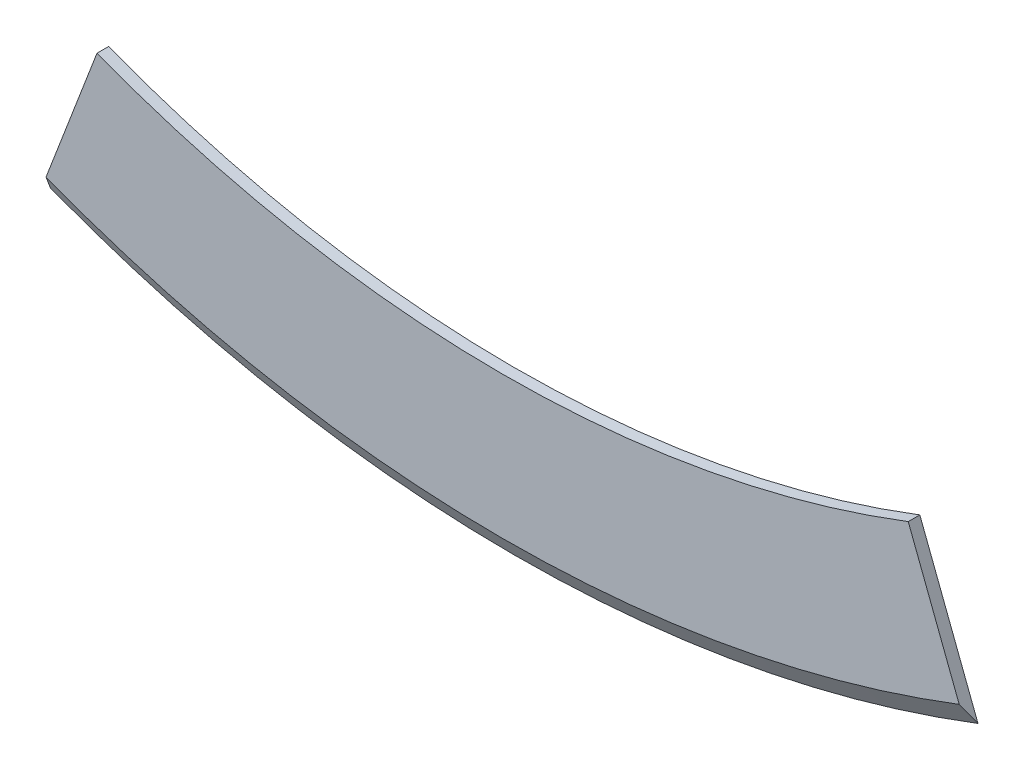
ISO-10303-21;
HEADER;
FILE_DESCRIPTION(('STEP AP214'),'2;1');
FILE_NAME('part.step','',(''),(''),'','','');
FILE_SCHEMA(('AUTOMOTIVE_DESIGN { 1 0 10303 214 1 1 1 1 }'));
ENDSEC;
DATA;
#1=APPLICATION_CONTEXT('core data for automotive mechanical design processes');
#2=APPLICATION_PROTOCOL_DEFINITION('international standard','automotive_design',2000,#1);
#3=PRODUCT_CONTEXT('',#1,'mechanical');
#4=PRODUCT('Part','Part','',(#3));
#5=PRODUCT_RELATED_PRODUCT_CATEGORY('part','',(#4));
#6=PRODUCT_DEFINITION_FORMATION('','',#4);
#7=PRODUCT_DEFINITION_CONTEXT('part definition',#1,'design');
#8=PRODUCT_DEFINITION('design','',#6,#7);
#9=PRODUCT_DEFINITION_SHAPE('','',#8);
#10=(LENGTH_UNIT() NAMED_UNIT(*) SI_UNIT(.MILLI.,.METRE.));
#11=(NAMED_UNIT(*) PLANE_ANGLE_UNIT() SI_UNIT($,.RADIAN.));
#12=(NAMED_UNIT(*) SI_UNIT($,.STERADIAN.) SOLID_ANGLE_UNIT());
#13=UNCERTAINTY_MEASURE_WITH_UNIT(LENGTH_MEASURE(1.E-05),#10,'distance_accuracy_value','');
#14=(GEOMETRIC_REPRESENTATION_CONTEXT(3) GLOBAL_UNCERTAINTY_ASSIGNED_CONTEXT((#13)) GLOBAL_UNIT_ASSIGNED_CONTEXT((#10,
#11,#12)) REPRESENTATION_CONTEXT('',''));
#15=CARTESIAN_POINT('',(0.,0.,0.));
#16=DIRECTION('',(0.,0.,1.));
#17=DIRECTION('',(1.,0.,0.));
#18=AXIS2_PLACEMENT_3D('',#15,#16,#17);
#19=CARTESIAN_POINT('',(0.,334.851373155043,3.));
#20=DIRECTION('',(0.,0.,-1.));
#21=DIRECTION('',(-1.,0.,0.));
#22=AXIS2_PLACEMENT_3D('',#19,#20,#21);
#23=CYLINDRICAL_SURFACE('',#22,292.851373155043);
#24=CARTESIAN_POINT('',(0.,334.851373155043,0.));
#25=DIRECTION('',(0.,0.,-1.));
#26=DIRECTION('',(1.,0.,0.));
#27=AXIS2_PLACEMENT_3D('',#24,#25,#26);
#28=CIRCLE('',#27,292.851373155043);
#29=CARTESIAN_POINT('',(104.948546119097,61.4510633046664,0.));
#30=VERTEX_POINT('',#29);
#31=CARTESIAN_POINT('',(-104.948546119097,61.4510633046664,0.));
#32=VERTEX_POINT('',#31);
#33=EDGE_CURVE('E89',#30,#32,#28,.T.);
#34=ORIENTED_EDGE('',*,*,#33,.T.);
#35=DIRECTION('',(0.,0.,-1.));
#36=VECTOR('',#35,1.);
#37=CARTESIAN_POINT('',(-104.948546119097,61.4510633046664,3.));
#38=LINE('',#37,#36);
#39=CARTESIAN_POINT('',(-104.948546119097,61.4510633046664,3.));
#40=VERTEX_POINT('',#39);
#41=EDGE_CURVE('E74',#40,#32,#38,.T.);
#42=ORIENTED_EDGE('',*,*,#41,.F.);
#43=CARTESIAN_POINT('',(0.,334.851373155043,3.));
#44=DIRECTION('',(0.,0.,-1.));
#45=DIRECTION('',(1.,0.,0.));
#46=AXIS2_PLACEMENT_3D('',#43,#44,#45);
#47=CIRCLE('',#46,292.851373155043);
#48=CARTESIAN_POINT('',(104.948546119097,61.4510633046664,3.));
#49=VERTEX_POINT('',#48);
#50=EDGE_CURVE('E78',#49,#40,#47,.T.);
#51=ORIENTED_EDGE('',*,*,#50,.F.);
#52=DIRECTION('',(0.,0.,-1.));
#53=VECTOR('',#52,1.);
#54=CARTESIAN_POINT('',(104.948546119097,61.4510633046664,3.));
#55=LINE('',#54,#53);
#56=EDGE_CURVE('E91',#49,#30,#55,.T.);
#57=ORIENTED_EDGE('',*,*,#56,.T.);
#58=EDGE_LOOP('',(#34,#42,#51,#57));
#59=FACE_BOUND('',#58,.T.);
#60=ADVANCED_FACE('F33',(#59),#23,.F.);
#61=CARTESIAN_POINT('',(-120.,22.240685391784,3.));
#62=DIRECTION('',(0.933580426497202,-0.358367949545299,0.));
#63=DIRECTION('',(0.358367949545299,0.933580426497203,0.));
#64=AXIS2_PLACEMENT_3D('',#61,#62,#63);
#65=PLANE('',#64);
#66=DIRECTION('',(-0.358367949545299,-0.933580426497202,0.));
#67=VECTOR('',#66,1.);
#68=CARTESIAN_POINT('',(-120.,22.240685391784,0.));
#69=LINE('',#68,#67);
#70=CARTESIAN_POINT('',(-120.,22.240685391784,0.));
#71=VERTEX_POINT('',#70);
#72=EDGE_CURVE('E103',#32,#71,#69,.T.);
#73=ORIENTED_EDGE('',*,*,#72,.T.);
#74=DIRECTION('',(-0.310355748208367,-0.808504365822485,-0.500000000000007));
#75=VECTOR('',#74,1.);
#76=CARTESIAN_POINT('',(3.23943555493937E-13,334.851373155043,193.326530429583));
#77=LINE('',#76,#75);
#78=CARTESIAN_POINT('',(-118.13786551075,27.091711586719,3.));
#79=VERTEX_POINT('',#78);
#80=EDGE_CURVE('E11',#71,#79,#77,.F.);
#81=ORIENTED_EDGE('',*,*,#80,.T.);
#82=DIRECTION('',(-0.358367949545299,-0.933580426497202,0.));
#83=VECTOR('',#82,1.);
#84=CARTESIAN_POINT('',(-120.,22.240685391784,3.));
#85=LINE('',#84,#83);
#86=EDGE_CURVE('E70',#40,#79,#85,.T.);
#87=ORIENTED_EDGE('',*,*,#86,.F.);
#88=ORIENTED_EDGE('',*,*,#41,.T.);
#89=EDGE_LOOP('',(#73,#81,#87,#88));
#90=FACE_BOUND('',#89,.T.);
#91=ADVANCED_FACE('F72',(#90),#65,.F.);
#92=CARTESIAN_POINT('',(120.,22.240685391784,3.));
#93=DIRECTION('',(-0.933580426497202,-0.358367949545299,0.));
#94=DIRECTION('',(0.358367949545299,-0.933580426497203,0.));
#95=AXIS2_PLACEMENT_3D('',#92,#93,#94);
#96=PLANE('',#95);
#97=DIRECTION('',(-0.358367949545299,0.933580426497202,0.));
#98=VECTOR('',#97,1.);
#99=CARTESIAN_POINT('',(120.,22.240685391784,3.));
#100=LINE('',#99,#98);
#101=CARTESIAN_POINT('',(118.13786551075,27.091711586719,3.));
#102=VERTEX_POINT('',#101);
#103=EDGE_CURVE('E77',#102,#49,#100,.T.);
#104=ORIENTED_EDGE('',*,*,#103,.F.);
#105=DIRECTION('',(-0.310355748208367,0.808504365822485,0.500000000000007));
#106=VECTOR('',#105,1.);
#107=CARTESIAN_POINT('',(-3.23857997528918E-13,334.851373155043,193.326530429583));
#108=LINE('',#107,#106);
#109=CARTESIAN_POINT('',(120.,22.2406853917839,0.));
#110=VERTEX_POINT('',#109);
#111=EDGE_CURVE('E41',#102,#110,#108,.F.);
#112=ORIENTED_EDGE('',*,*,#111,.T.);
#113=DIRECTION('',(-0.358367949545299,0.933580426497202,0.));
#114=VECTOR('',#113,1.);
#115=CARTESIAN_POINT('',(120.,22.240685391784,0.));
#116=LINE('',#115,#114);
#117=EDGE_CURVE('E86',#110,#30,#116,.T.);
#118=ORIENTED_EDGE('',*,*,#117,.T.);
#119=ORIENTED_EDGE('',*,*,#56,.F.);
#120=EDGE_LOOP('',(#104,#112,#118,#119));
#121=FACE_BOUND('',#120,.T.);
#122=ADVANCED_FACE('F98',(#121),#96,.F.);
#123=CARTESIAN_POINT('',(0.,334.851373155043,3.));
#124=DIRECTION('',(0.,0.,1.));
#125=DIRECTION('',(1.,0.,0.));
#126=AXIS2_PLACEMENT_3D('',#123,#124,#125);
#127=PLANE('',#126);
#128=ORIENTED_EDGE('',*,*,#86,.T.);
#129=CARTESIAN_POINT('',(0.,334.851373155043,3.));
#130=DIRECTION('',(0.,0.,1.));
#131=DIRECTION('',(1.,0.,0.));
#132=AXIS2_PLACEMENT_3D('',#129,#130,#131);
#133=CIRCLE('',#132,329.655220732336);
#134=EDGE_CURVE('E90',#79,#102,#133,.T.);
#135=ORIENTED_EDGE('',*,*,#134,.T.);
#136=ORIENTED_EDGE('',*,*,#103,.T.);
#137=ORIENTED_EDGE('',*,*,#50,.T.);
#138=EDGE_LOOP('',(#128,#135,#136,#137));
#139=FACE_BOUND('',#138,.T.);
#140=ADVANCED_FACE('F81',(#139),#127,.T.);
#141=CARTESIAN_POINT('',(0.,334.851373155043,0.));
#142=DIRECTION('',(0.,0.,1.));
#143=DIRECTION('',(1.,0.,0.));
#144=AXIS2_PLACEMENT_3D('',#141,#142,#143);
#145=PLANE('',#144);
#146=ORIENTED_EDGE('',*,*,#33,.F.);
#147=ORIENTED_EDGE('',*,*,#117,.F.);
#148=CARTESIAN_POINT('',(0.,334.851373155043,0.));
#149=DIRECTION('',(0.,0.,1.));
#150=DIRECTION('',(1.,0.,0.));
#151=AXIS2_PLACEMENT_3D('',#148,#149,#150);
#152=CIRCLE('',#151,334.851373155043);
#153=EDGE_CURVE('E102',#71,#110,#152,.T.);
#154=ORIENTED_EDGE('',*,*,#153,.F.);
#155=ORIENTED_EDGE('',*,*,#72,.F.);
#156=EDGE_LOOP('',(#146,#147,#154,#155));
#157=FACE_BOUND('',#156,.T.);
#158=ADVANCED_FACE('F101',(#157),#145,.F.);
#159=CARTESIAN_POINT('',(0.,334.851373155043,3.));
#160=DIRECTION('',(0.,0.,-1.));
#161=DIRECTION('',(-1.,0.,0.));
#162=AXIS2_PLACEMENT_3D('',#159,#160,#161);
#163=CONICAL_SURFACE('',#162,329.655220732336,1.04719755119659);
#164=ORIENTED_EDGE('',*,*,#80,.F.);
#165=ORIENTED_EDGE('',*,*,#153,.T.);
#166=ORIENTED_EDGE('',*,*,#111,.F.);
#167=ORIENTED_EDGE('',*,*,#134,.F.);
#168=EDGE_LOOP('',(#164,#165,#166,#167));
#169=FACE_BOUND('',#168,.T.);
#170=ADVANCED_FACE('F35',(#169),#163,.T.);
#171=CLOSED_SHELL('',(#60,#91,#122,#140,#158,#170));
#172=MANIFOLD_SOLID_BREP('B2',#171);
#173=ADVANCED_BREP_SHAPE_REPRESENTATION('',(#18,#172),#14);
#174=SHAPE_DEFINITION_REPRESENTATION(#9,#173);
ENDSEC;
END-ISO-10303-21;
